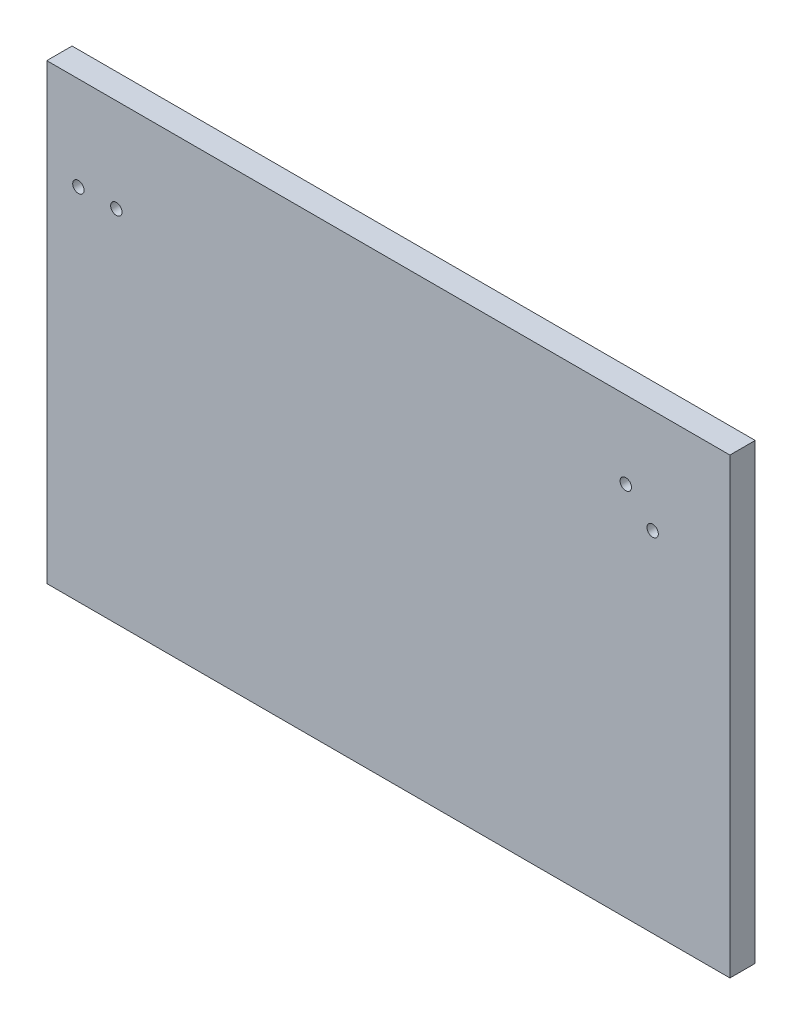
ISO-10303-21;
HEADER;
FILE_DESCRIPTION(('STEP AP214'),'2;1');
FILE_NAME('part.step','',(''),(''),'','','');
FILE_SCHEMA(('AUTOMOTIVE_DESIGN { 1 0 10303 214 1 1 1 1 }'));
ENDSEC;
DATA;
#1=APPLICATION_CONTEXT('core data for automotive mechanical design processes');
#2=APPLICATION_PROTOCOL_DEFINITION('international standard','automotive_design',2000,#1);
#3=PRODUCT_CONTEXT('',#1,'mechanical');
#4=PRODUCT('Part','Part','',(#3));
#5=PRODUCT_RELATED_PRODUCT_CATEGORY('part','',(#4));
#6=PRODUCT_DEFINITION_FORMATION('','',#4);
#7=PRODUCT_DEFINITION_CONTEXT('part definition',#1,'design');
#8=PRODUCT_DEFINITION('design','',#6,#7);
#9=PRODUCT_DEFINITION_SHAPE('','',#8);
#10=(LENGTH_UNIT() NAMED_UNIT(*) SI_UNIT(.MILLI.,.METRE.));
#11=(NAMED_UNIT(*) PLANE_ANGLE_UNIT() SI_UNIT($,.RADIAN.));
#12=(NAMED_UNIT(*) SI_UNIT($,.STERADIAN.) SOLID_ANGLE_UNIT());
#13=UNCERTAINTY_MEASURE_WITH_UNIT(LENGTH_MEASURE(1.E-05),#10,'distance_accuracy_value','');
#14=(GEOMETRIC_REPRESENTATION_CONTEXT(3) GLOBAL_UNCERTAINTY_ASSIGNED_CONTEXT((#13)) GLOBAL_UNIT_ASSIGNED_CONTEXT((#10,
#11,#12)) REPRESENTATION_CONTEXT('',''));
#15=CARTESIAN_POINT('',(0.,0.,0.));
#16=DIRECTION('',(0.,0.,1.));
#17=DIRECTION('',(1.,0.,0.));
#18=AXIS2_PLACEMENT_3D('',#15,#16,#17);
#19=CARTESIAN_POINT('',(0.,0.,10.));
#20=DIRECTION('',(-1.,0.,0.));
#21=DIRECTION('',(0.,0.,1.));
#22=AXIS2_PLACEMENT_3D('',#19,#20,#21);
#23=PLANE('',#22);
#24=DIRECTION('',(0.,1.,0.));
#25=VECTOR('',#24,1.);
#26=CARTESIAN_POINT('',(0.,0.,0.));
#27=LINE('',#26,#25);
#28=CARTESIAN_POINT('',(0.,0.,0.));
#29=VERTEX_POINT('',#28);
#30=CARTESIAN_POINT('',(0.,179.,0.));
#31=VERTEX_POINT('',#30);
#32=EDGE_CURVE('E100',#29,#31,#27,.T.);
#33=ORIENTED_EDGE('',*,*,#32,.T.);
#34=DIRECTION('',(0.,0.,-1.));
#35=VECTOR('',#34,1.);
#36=CARTESIAN_POINT('',(0.,179.,10.));
#37=LINE('',#36,#35);
#38=CARTESIAN_POINT('',(0.,179.,10.));
#39=VERTEX_POINT('',#38);
#40=EDGE_CURVE('E11',#39,#31,#37,.T.);
#41=ORIENTED_EDGE('',*,*,#40,.F.);
#42=DIRECTION('',(0.,1.,0.));
#43=VECTOR('',#42,1.);
#44=CARTESIAN_POINT('',(0.,0.,10.));
#45=LINE('',#44,#43);
#46=CARTESIAN_POINT('',(0.,0.,10.));
#47=VERTEX_POINT('',#46);
#48=EDGE_CURVE('E88',#47,#39,#45,.T.);
#49=ORIENTED_EDGE('',*,*,#48,.F.);
#50=DIRECTION('',(0.,0.,-1.));
#51=VECTOR('',#50,1.);
#52=CARTESIAN_POINT('',(0.,0.,10.));
#53=LINE('',#52,#51);
#54=EDGE_CURVE('E96',#47,#29,#53,.T.);
#55=ORIENTED_EDGE('',*,*,#54,.T.);
#56=EDGE_LOOP('',(#33,#41,#49,#55));
#57=FACE_BOUND('',#56,.T.);
#58=ADVANCED_FACE('F37',(#57),#23,.F.);
#59=CARTESIAN_POINT('',(0.,179.,10.));
#60=DIRECTION('',(0.,-1.,0.));
#61=DIRECTION('',(1.,0.,0.));
#62=AXIS2_PLACEMENT_3D('',#59,#60,#61);
#63=PLANE('',#62);
#64=DIRECTION('',(-1.,0.,0.));
#65=VECTOR('',#64,1.);
#66=CARTESIAN_POINT('',(0.,179.,0.));
#67=LINE('',#66,#65);
#68=CARTESIAN_POINT('',(-270.,179.,0.));
#69=VERTEX_POINT('',#68);
#70=EDGE_CURVE('E92',#31,#69,#67,.T.);
#71=ORIENTED_EDGE('',*,*,#70,.T.);
#72=DIRECTION('',(0.,0.,-1.));
#73=VECTOR('',#72,1.);
#74=CARTESIAN_POINT('',(-270.,179.,10.));
#75=LINE('',#74,#73);
#76=CARTESIAN_POINT('',(-270.,179.,10.));
#77=VERTEX_POINT('',#76);
#78=EDGE_CURVE('E45',#77,#69,#75,.T.);
#79=ORIENTED_EDGE('',*,*,#78,.F.);
#80=DIRECTION('',(-1.,0.,0.));
#81=VECTOR('',#80,1.);
#82=CARTESIAN_POINT('',(0.,179.,10.));
#83=LINE('',#82,#81);
#84=EDGE_CURVE('E83',#39,#77,#83,.T.);
#85=ORIENTED_EDGE('',*,*,#84,.F.);
#86=ORIENTED_EDGE('',*,*,#40,.T.);
#87=EDGE_LOOP('',(#71,#79,#85,#86));
#88=FACE_BOUND('',#87,.T.);
#89=ADVANCED_FACE('F91',(#88),#63,.F.);
#90=CARTESIAN_POINT('',(-270.,0.,10.));
#91=DIRECTION('',(1.,0.,0.));
#92=DIRECTION('',(0.,0.,-1.));
#93=AXIS2_PLACEMENT_3D('',#90,#91,#92);
#94=PLANE('',#93);
#95=DIRECTION('',(0.,-1.,0.));
#96=VECTOR('',#95,1.);
#97=CARTESIAN_POINT('',(-270.,0.,0.));
#98=LINE('',#97,#96);
#99=CARTESIAN_POINT('',(-270.,0.,0.));
#100=VERTEX_POINT('',#99);
#101=EDGE_CURVE('E70',#69,#100,#98,.T.);
#102=ORIENTED_EDGE('',*,*,#101,.T.);
#103=DIRECTION('',(0.,0.,-1.));
#104=VECTOR('',#103,1.);
#105=CARTESIAN_POINT('',(-270.,0.,10.));
#106=LINE('',#105,#104);
#107=CARTESIAN_POINT('',(-270.,0.,10.));
#108=VERTEX_POINT('',#107);
#109=EDGE_CURVE('E93',#108,#100,#106,.T.);
#110=ORIENTED_EDGE('',*,*,#109,.F.);
#111=DIRECTION('',(0.,-1.,0.));
#112=VECTOR('',#111,1.);
#113=CARTESIAN_POINT('',(-270.,0.,10.));
#114=LINE('',#113,#112);
#115=EDGE_CURVE('E86',#77,#108,#114,.T.);
#116=ORIENTED_EDGE('',*,*,#115,.F.);
#117=ORIENTED_EDGE('',*,*,#78,.T.);
#118=EDGE_LOOP('',(#102,#110,#116,#117));
#119=FACE_BOUND('',#118,.T.);
#120=ADVANCED_FACE('F94',(#119),#94,.F.);
#121=CARTESIAN_POINT('',(0.,0.,10.));
#122=DIRECTION('',(0.,1.,0.));
#123=DIRECTION('',(0.,0.,1.));
#124=AXIS2_PLACEMENT_3D('',#121,#122,#123);
#125=PLANE('',#124);
#126=DIRECTION('',(1.,0.,0.));
#127=VECTOR('',#126,1.);
#128=CARTESIAN_POINT('',(0.,0.,0.));
#129=LINE('',#128,#127);
#130=EDGE_CURVE('E76',#100,#29,#129,.T.);
#131=ORIENTED_EDGE('',*,*,#130,.T.);
#132=ORIENTED_EDGE('',*,*,#54,.F.);
#133=DIRECTION('',(1.,0.,0.));
#134=VECTOR('',#133,1.);
#135=CARTESIAN_POINT('',(0.,0.,10.));
#136=LINE('',#135,#134);
#137=EDGE_CURVE('E53',#108,#47,#136,.T.);
#138=ORIENTED_EDGE('',*,*,#137,.F.);
#139=ORIENTED_EDGE('',*,*,#109,.T.);
#140=EDGE_LOOP('',(#131,#132,#138,#139));
#141=FACE_BOUND('',#140,.T.);
#142=ADVANCED_FACE('F108',(#141),#125,.F.);
#143=CARTESIAN_POINT('',(0.,0.,10.));
#144=DIRECTION('',(0.,0.,1.));
#145=DIRECTION('',(1.,0.,0.));
#146=AXIS2_PLACEMENT_3D('',#143,#144,#145);
#147=PLANE('',#146);
#148=CARTESIAN_POINT('',(-30.5545635173702,137.838834764832,10.));
#149=DIRECTION('',(0.,0.,-1.));
#150=DIRECTION('',(-1.,0.,0.));
#151=AXIS2_PLACEMENT_3D('',#148,#149,#150);
#152=CIRCLE('',#151,2.25);
#153=CARTESIAN_POINT('',(-32.8045635173702,137.838834764832,10.));
#154=VERTEX_POINT('',#153);
#155=EDGE_CURVE('E120',#154,#154,#152,.T.);
#156=ORIENTED_EDGE('',*,*,#155,.T.);
#157=EDGE_LOOP('',(#156));
#158=FACE_BOUND('',#157,.T.);
#159=CARTESIAN_POINT('',(-41.1611652351684,148.44543648263,10.));
#160=DIRECTION('',(0.,0.,-1.));
#161=DIRECTION('',(-1.,0.,0.));
#162=AXIS2_PLACEMENT_3D('',#159,#160,#161);
#163=CIRCLE('',#162,2.25);
#164=CARTESIAN_POINT('',(-43.4111652351684,148.44543648263,10.));
#165=VERTEX_POINT('',#164);
#166=EDGE_CURVE('E126',#165,#165,#163,.T.);
#167=ORIENTED_EDGE('',*,*,#166,.T.);
#168=EDGE_LOOP('',(#167));
#169=FACE_BOUND('',#168,.T.);
#170=CARTESIAN_POINT('',(-257.5,142.,10.));
#171=DIRECTION('',(0.,0.,-1.));
#172=DIRECTION('',(-1.,0.,0.));
#173=AXIS2_PLACEMENT_3D('',#170,#171,#172);
#174=CIRCLE('',#173,2.24999999999996);
#175=CARTESIAN_POINT('',(-259.75,142.,10.));
#176=VERTEX_POINT('',#175);
#177=EDGE_CURVE('E132',#176,#176,#174,.T.);
#178=ORIENTED_EDGE('',*,*,#177,.T.);
#179=EDGE_LOOP('',(#178));
#180=FACE_BOUND('',#179,.T.);
#181=CARTESIAN_POINT('',(-242.5,142.,10.));
#182=DIRECTION('',(0.,0.,-1.));
#183=DIRECTION('',(-1.,0.,0.));
#184=AXIS2_PLACEMENT_3D('',#181,#182,#183);
#185=CIRCLE('',#184,2.25000000000001);
#186=CARTESIAN_POINT('',(-244.75,142.,10.));
#187=VERTEX_POINT('',#186);
#188=EDGE_CURVE('E103',#187,#187,#185,.T.);
#189=ORIENTED_EDGE('',*,*,#188,.T.);
#190=EDGE_LOOP('',(#189));
#191=FACE_BOUND('',#190,.T.);
#192=ORIENTED_EDGE('',*,*,#48,.T.);
#193=ORIENTED_EDGE('',*,*,#84,.T.);
#194=ORIENTED_EDGE('',*,*,#115,.T.);
#195=ORIENTED_EDGE('',*,*,#137,.T.);
#196=EDGE_LOOP('',(#192,#193,#194,#195));
#197=FACE_BOUND('',#196,.T.);
#198=ADVANCED_FACE('F84',(#158,#169,#180,#191,#197),#147,.T.);
#199=CARTESIAN_POINT('',(0.,0.,0.));
#200=DIRECTION('',(0.,0.,1.));
#201=DIRECTION('',(1.,0.,0.));
#202=AXIS2_PLACEMENT_3D('',#199,#200,#201);
#203=PLANE('',#202);
#204=CARTESIAN_POINT('',(-30.5545635173702,137.838834764832,0.));
#205=DIRECTION('',(0.,0.,-1.));
#206=DIRECTION('',(-1.,0.,0.));
#207=AXIS2_PLACEMENT_3D('',#204,#205,#206);
#208=CIRCLE('',#207,2.25);
#209=CARTESIAN_POINT('',(-32.8045635173702,137.838834764832,0.));
#210=VERTEX_POINT('',#209);
#211=EDGE_CURVE('E123',#210,#210,#208,.T.);
#212=ORIENTED_EDGE('',*,*,#211,.F.);
#213=EDGE_LOOP('',(#212));
#214=FACE_BOUND('',#213,.T.);
#215=CARTESIAN_POINT('',(-41.1611652351684,148.44543648263,0.));
#216=DIRECTION('',(0.,0.,-1.));
#217=DIRECTION('',(-1.,0.,0.));
#218=AXIS2_PLACEMENT_3D('',#215,#216,#217);
#219=CIRCLE('',#218,2.25);
#220=CARTESIAN_POINT('',(-43.4111652351684,148.44543648263,0.));
#221=VERTEX_POINT('',#220);
#222=EDGE_CURVE('E129',#221,#221,#219,.T.);
#223=ORIENTED_EDGE('',*,*,#222,.F.);
#224=EDGE_LOOP('',(#223));
#225=FACE_BOUND('',#224,.T.);
#226=CARTESIAN_POINT('',(-257.5,142.,0.));
#227=DIRECTION('',(0.,0.,-1.));
#228=DIRECTION('',(-1.,0.,0.));
#229=AXIS2_PLACEMENT_3D('',#226,#227,#228);
#230=CIRCLE('',#229,2.24999999999996);
#231=CARTESIAN_POINT('',(-259.75,142.,0.));
#232=VERTEX_POINT('',#231);
#233=EDGE_CURVE('E117',#232,#232,#230,.T.);
#234=ORIENTED_EDGE('',*,*,#233,.F.);
#235=EDGE_LOOP('',(#234));
#236=FACE_BOUND('',#235,.T.);
#237=CARTESIAN_POINT('',(-242.5,142.,0.));
#238=DIRECTION('',(0.,0.,-1.));
#239=DIRECTION('',(-1.,0.,0.));
#240=AXIS2_PLACEMENT_3D('',#237,#238,#239);
#241=CIRCLE('',#240,2.25000000000001);
#242=CARTESIAN_POINT('',(-244.75,142.,0.));
#243=VERTEX_POINT('',#242);
#244=EDGE_CURVE('E114',#243,#243,#241,.T.);
#245=ORIENTED_EDGE('',*,*,#244,.F.);
#246=EDGE_LOOP('',(#245));
#247=FACE_BOUND('',#246,.T.);
#248=ORIENTED_EDGE('',*,*,#32,.F.);
#249=ORIENTED_EDGE('',*,*,#130,.F.);
#250=ORIENTED_EDGE('',*,*,#101,.F.);
#251=ORIENTED_EDGE('',*,*,#70,.F.);
#252=EDGE_LOOP('',(#248,#249,#250,#251));
#253=FACE_BOUND('',#252,.T.);
#254=ADVANCED_FACE('F111',(#214,#225,#236,#247,#253),#203,.F.);
#255=CARTESIAN_POINT('',(-242.5,142.,10.));
#256=DIRECTION('',(0.,0.,-1.));
#257=DIRECTION('',(-1.,0.,0.));
#258=AXIS2_PLACEMENT_3D('',#255,#256,#257);
#259=CYLINDRICAL_SURFACE('',#258,2.25000000000001);
#260=ORIENTED_EDGE('',*,*,#188,.F.);
#261=EDGE_LOOP('',(#260));
#262=FACE_BOUND('',#261,.T.);
#263=ORIENTED_EDGE('',*,*,#244,.T.);
#264=EDGE_LOOP('',(#263));
#265=FACE_BOUND('',#264,.T.);
#266=ADVANCED_FACE('F142',(#262,#265),#259,.F.);
#267=CARTESIAN_POINT('',(-257.5,142.,10.));
#268=DIRECTION('',(0.,0.,-1.));
#269=DIRECTION('',(-1.,0.,0.));
#270=AXIS2_PLACEMENT_3D('',#267,#268,#269);
#271=CYLINDRICAL_SURFACE('',#270,2.24999999999996);
#272=ORIENTED_EDGE('',*,*,#177,.F.);
#273=EDGE_LOOP('',(#272));
#274=FACE_BOUND('',#273,.T.);
#275=ORIENTED_EDGE('',*,*,#233,.T.);
#276=EDGE_LOOP('',(#275));
#277=FACE_BOUND('',#276,.T.);
#278=ADVANCED_FACE('F138',(#274,#277),#271,.F.);
#279=CARTESIAN_POINT('',(-41.1611652351684,148.44543648263,10.));
#280=DIRECTION('',(0.,0.,-1.));
#281=DIRECTION('',(-1.,0.,0.));
#282=AXIS2_PLACEMENT_3D('',#279,#280,#281);
#283=CYLINDRICAL_SURFACE('',#282,2.25);
#284=ORIENTED_EDGE('',*,*,#166,.F.);
#285=EDGE_LOOP('',(#284));
#286=FACE_BOUND('',#285,.T.);
#287=ORIENTED_EDGE('',*,*,#222,.T.);
#288=EDGE_LOOP('',(#287));
#289=FACE_BOUND('',#288,.T.);
#290=ADVANCED_FACE('F153',(#286,#289),#283,.F.);
#291=CARTESIAN_POINT('',(-30.5545635173702,137.838834764832,10.));
#292=DIRECTION('',(0.,0.,-1.));
#293=DIRECTION('',(-1.,0.,0.));
#294=AXIS2_PLACEMENT_3D('',#291,#292,#293);
#295=CYLINDRICAL_SURFACE('',#294,2.25);
#296=ORIENTED_EDGE('',*,*,#155,.F.);
#297=EDGE_LOOP('',(#296));
#298=FACE_BOUND('',#297,.T.);
#299=ORIENTED_EDGE('',*,*,#211,.T.);
#300=EDGE_LOOP('',(#299));
#301=FACE_BOUND('',#300,.T.);
#302=ADVANCED_FACE('F182',(#298,#301),#295,.F.);
#303=CLOSED_SHELL('',(#58,#89,#120,#142,#198,#254,#266,#278,#290,#302));
#304=MANIFOLD_SOLID_BREP('B2',#303);
#305=ADVANCED_BREP_SHAPE_REPRESENTATION('',(#18,#304),#14);
#306=SHAPE_DEFINITION_REPRESENTATION(#9,#305);
ENDSEC;
END-ISO-10303-21;
